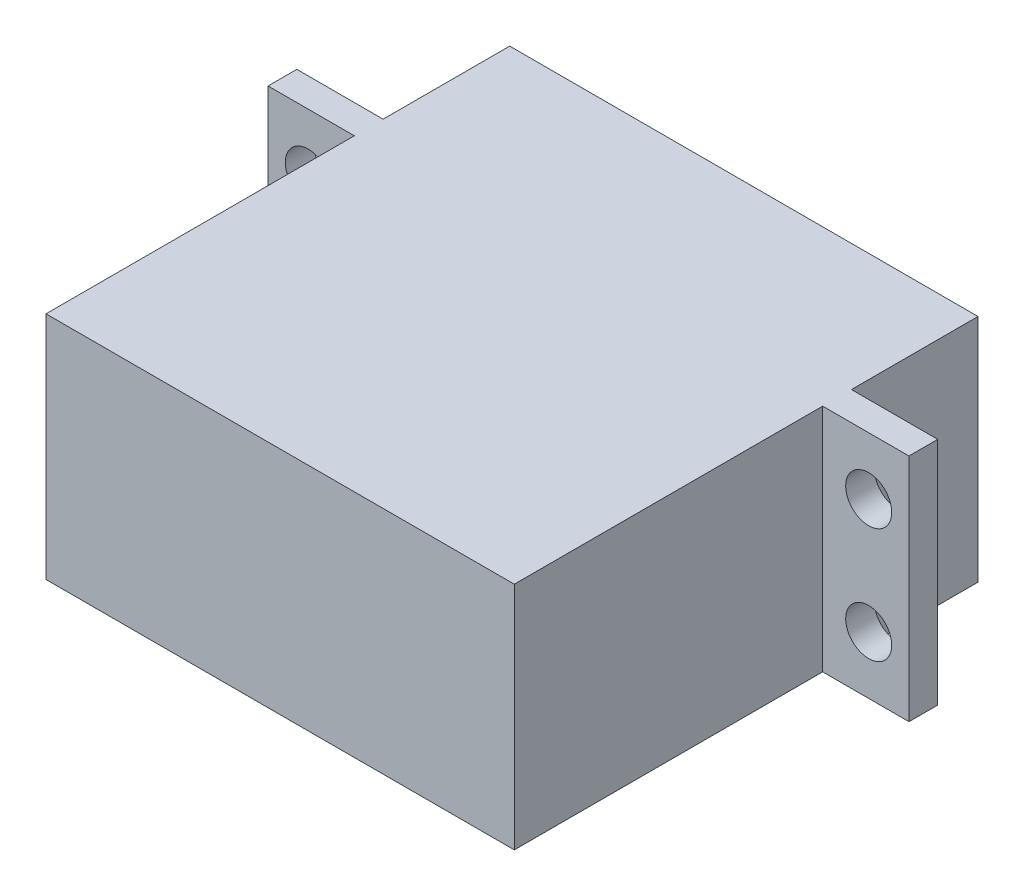
ISO-10303-21;
HEADER;
FILE_DESCRIPTION(('STEP AP214'),'2;1');
FILE_NAME('part.step','',(''),(''),'','','');
FILE_SCHEMA(('AUTOMOTIVE_DESIGN { 1 0 10303 214 1 1 1 1 }'));
ENDSEC;
DATA;
#1=APPLICATION_CONTEXT('core data for automotive mechanical design processes');
#2=APPLICATION_PROTOCOL_DEFINITION('international standard','automotive_design',2000,#1);
#3=PRODUCT_CONTEXT('',#1,'mechanical');
#4=PRODUCT('Part','Part','',(#3));
#5=PRODUCT_RELATED_PRODUCT_CATEGORY('part','',(#4));
#6=PRODUCT_DEFINITION_FORMATION('','',#4);
#7=PRODUCT_DEFINITION_CONTEXT('part definition',#1,'design');
#8=PRODUCT_DEFINITION('design','',#6,#7);
#9=PRODUCT_DEFINITION_SHAPE('','',#8);
#10=(LENGTH_UNIT() NAMED_UNIT(*) SI_UNIT(.MILLI.,.METRE.));
#11=(NAMED_UNIT(*) PLANE_ANGLE_UNIT() SI_UNIT($,.RADIAN.));
#12=(NAMED_UNIT(*) SI_UNIT($,.STERADIAN.) SOLID_ANGLE_UNIT());
#13=UNCERTAINTY_MEASURE_WITH_UNIT(LENGTH_MEASURE(1.E-05),#10,'distance_accuracy_value','');
#14=(GEOMETRIC_REPRESENTATION_CONTEXT(3) GLOBAL_UNCERTAINTY_ASSIGNED_CONTEXT((#13)) GLOBAL_UNIT_ASSIGNED_CONTEXT((#10,
#11,#12)) REPRESENTATION_CONTEXT('',''));
#15=CARTESIAN_POINT('',(0.,0.,0.));
#16=DIRECTION('',(0.,0.,1.));
#17=DIRECTION('',(1.,0.,0.));
#18=AXIS2_PLACEMENT_3D('',#15,#16,#17);
#19=CARTESIAN_POINT('',(0.,0.,0.));
#20=DIRECTION('',(0.,0.,-1.));
#21=DIRECTION('',(-1.,0.,0.));
#22=AXIS2_PLACEMENT_3D('',#19,#20,#21);
#23=PLANE('',#22);
#24=DIRECTION('',(0.,1.,0.));
#25=VECTOR('',#24,1.);
#26=CARTESIAN_POINT('',(20.35,-10.,0.));
#27=LINE('',#26,#25);
#28=CARTESIAN_POINT('',(20.35,-10.,0.));
#29=VERTEX_POINT('',#28);
#30=CARTESIAN_POINT('',(20.35,10.,0.));
#31=VERTEX_POINT('',#30);
#32=EDGE_CURVE('E205',#29,#31,#27,.T.);
#33=ORIENTED_EDGE('',*,*,#32,.F.);
#34=DIRECTION('',(1.,0.,0.));
#35=VECTOR('',#34,1.);
#36=CARTESIAN_POINT('',(-20.35,-10.,0.));
#37=LINE('',#36,#35);
#38=CARTESIAN_POINT('',(-20.35,-10.,0.));
#39=VERTEX_POINT('',#38);
#40=EDGE_CURVE('E242',#39,#29,#37,.T.);
#41=ORIENTED_EDGE('',*,*,#40,.F.);
#42=DIRECTION('',(0.,-1.,0.));
#43=VECTOR('',#42,1.);
#44=CARTESIAN_POINT('',(-20.35,-10.,0.));
#45=LINE('',#44,#43);
#46=CARTESIAN_POINT('',(-20.35,10.,0.));
#47=VERTEX_POINT('',#46);
#48=EDGE_CURVE('E128',#47,#39,#45,.T.);
#49=ORIENTED_EDGE('',*,*,#48,.F.);
#50=DIRECTION('',(-1.,0.,0.));
#51=VECTOR('',#50,1.);
#52=CARTESIAN_POINT('',(-20.35,10.,0.));
#53=LINE('',#52,#51);
#54=EDGE_CURVE('E235',#31,#47,#53,.T.);
#55=ORIENTED_EDGE('',*,*,#54,.F.);
#56=EDGE_LOOP('',(#33,#41,#49,#55));
#57=FACE_BOUND('',#56,.T.);
#58=CARTESIAN_POINT('',(10.35,0.,0.));
#59=DIRECTION('',(0.,0.,-1.));
#60=DIRECTION('',(-1.,0.,0.));
#61=AXIS2_PLACEMENT_3D('',#58,#59,#60);
#62=CIRCLE('',#61,3.);
#63=CARTESIAN_POINT('',(7.34999999999999,0.,0.));
#64=VERTEX_POINT('',#63);
#65=EDGE_CURVE('E482',#64,#64,#62,.T.);
#66=ORIENTED_EDGE('',*,*,#65,.F.);
#67=EDGE_LOOP('',(#66));
#68=FACE_BOUND('',#67,.T.);
#69=ADVANCED_FACE('F34',(#57,#68),#23,.T.);
#70=CARTESIAN_POINT('',(-20.35,-10.,40.3));
#71=DIRECTION('',(1.,0.,0.));
#72=DIRECTION('',(0.,0.,-1.));
#73=AXIS2_PLACEMENT_3D('',#70,#71,#72);
#74=PLANE('',#73);
#75=DIRECTION('',(0.,-1.,0.));
#76=VECTOR('',#75,1.);
#77=CARTESIAN_POINT('',(-20.35,0.,11.));
#78=LINE('',#77,#76);
#79=CARTESIAN_POINT('',(-20.35,10.,11.));
#80=VERTEX_POINT('',#79);
#81=CARTESIAN_POINT('',(-20.35,-10.,11.));
#82=VERTEX_POINT('',#81);
#83=EDGE_CURVE('E51',#80,#82,#78,.T.);
#84=ORIENTED_EDGE('',*,*,#83,.F.);
#85=DIRECTION('',(0.,0.,-1.));
#86=VECTOR('',#85,1.);
#87=CARTESIAN_POINT('',(-20.35,10.,40.3));
#88=LINE('',#87,#86);
#89=EDGE_CURVE('E219',#80,#47,#88,.T.);
#90=ORIENTED_EDGE('',*,*,#89,.T.);
#91=ORIENTED_EDGE('',*,*,#48,.T.);
#92=DIRECTION('',(0.,0.,-1.));
#93=VECTOR('',#92,1.);
#94=CARTESIAN_POINT('',(-20.35,-10.,40.3));
#95=LINE('',#94,#93);
#96=EDGE_CURVE('E124',#82,#39,#95,.T.);
#97=ORIENTED_EDGE('',*,*,#96,.F.);
#98=EDGE_LOOP('',(#84,#90,#91,#97));
#99=FACE_BOUND('',#98,.T.);
#100=ADVANCED_FACE('F126',(#99),#74,.F.);
#101=CARTESIAN_POINT('',(20.35,-10.,40.3));
#102=DIRECTION('',(-1.,0.,0.));
#103=DIRECTION('',(0.,0.,1.));
#104=AXIS2_PLACEMENT_3D('',#101,#102,#103);
#105=PLANE('',#104);
#106=DIRECTION('',(0.,-1.,0.));
#107=VECTOR('',#106,1.);
#108=CARTESIAN_POINT('',(20.35,0.,13.5));
#109=LINE('',#108,#107);
#110=CARTESIAN_POINT('',(20.35,10.,13.5));
#111=VERTEX_POINT('',#110);
#112=CARTESIAN_POINT('',(20.35,-10.,13.5));
#113=VERTEX_POINT('',#112);
#114=EDGE_CURVE('E188',#111,#113,#109,.T.);
#115=ORIENTED_EDGE('',*,*,#114,.F.);
#116=DIRECTION('',(0.,0.,-1.));
#117=VECTOR('',#116,1.);
#118=CARTESIAN_POINT('',(20.35,10.,40.3));
#119=LINE('',#118,#117);
#120=CARTESIAN_POINT('',(20.35,10.,40.3));
#121=VERTEX_POINT('',#120);
#122=EDGE_CURVE('E11',#121,#111,#119,.T.);
#123=ORIENTED_EDGE('',*,*,#122,.F.);
#124=DIRECTION('',(0.,1.,0.));
#125=VECTOR('',#124,1.);
#126=CARTESIAN_POINT('',(20.35,-10.,40.3));
#127=LINE('',#126,#125);
#128=CARTESIAN_POINT('',(20.35,-10.,40.3));
#129=VERTEX_POINT('',#128);
#130=EDGE_CURVE('E244',#129,#121,#127,.T.);
#131=ORIENTED_EDGE('',*,*,#130,.F.);
#132=DIRECTION('',(0.,0.,-1.));
#133=VECTOR('',#132,1.);
#134=CARTESIAN_POINT('',(20.35,-10.,40.3));
#135=LINE('',#134,#133);
#136=EDGE_CURVE('E133',#129,#113,#135,.T.);
#137=ORIENTED_EDGE('',*,*,#136,.T.);
#138=EDGE_LOOP('',(#115,#123,#131,#137));
#139=FACE_BOUND('',#138,.T.);
#140=ADVANCED_FACE('F260',(#139),#105,.F.);
#141=CARTESIAN_POINT('',(20.35,10.,11.));
#142=VERTEX_POINT('',#141);
#143=EDGE_CURVE('E43',#142,#31,#119,.T.);
#144=ORIENTED_EDGE('',*,*,#143,.F.);
#145=DIRECTION('',(0.,-1.,0.));
#146=VECTOR('',#145,1.);
#147=CARTESIAN_POINT('',(20.35,0.,11.));
#148=LINE('',#147,#146);
#149=CARTESIAN_POINT('',(20.35,-10.,11.));
#150=VERTEX_POINT('',#149);
#151=EDGE_CURVE('E175',#142,#150,#148,.T.);
#152=ORIENTED_EDGE('',*,*,#151,.T.);
#153=EDGE_CURVE('E193',#150,#29,#135,.T.);
#154=ORIENTED_EDGE('',*,*,#153,.T.);
#155=ORIENTED_EDGE('',*,*,#32,.T.);
#156=EDGE_LOOP('',(#144,#152,#154,#155));
#157=FACE_BOUND('',#156,.T.);
#158=ADVANCED_FACE('F36',(#157),#105,.F.);
#159=CARTESIAN_POINT('',(-20.35,10.,40.3));
#160=DIRECTION('',(0.,-1.,0.));
#161=DIRECTION('',(0.,0.,-1.));
#162=AXIS2_PLACEMENT_3D('',#159,#160,#161);
#163=PLANE('',#162);
#164=ORIENTED_EDGE('',*,*,#54,.T.);
#165=ORIENTED_EDGE('',*,*,#89,.F.);
#166=DIRECTION('',(-1.,0.,0.));
#167=VECTOR('',#166,1.);
#168=CARTESIAN_POINT('',(-20.35,10.,11.));
#169=LINE('',#168,#167);
#170=CARTESIAN_POINT('',(-27.85,10.,11.));
#171=VERTEX_POINT('',#170);
#172=EDGE_CURVE('E145',#80,#171,#169,.T.);
#173=ORIENTED_EDGE('',*,*,#172,.T.);
#174=DIRECTION('',(0.,0.,1.));
#175=VECTOR('',#174,1.);
#176=CARTESIAN_POINT('',(-27.85,10.,0.));
#177=LINE('',#176,#175);
#178=CARTESIAN_POINT('',(-27.85,10.,13.5));
#179=VERTEX_POINT('',#178);
#180=EDGE_CURVE('E163',#171,#179,#177,.T.);
#181=ORIENTED_EDGE('',*,*,#180,.T.);
#182=DIRECTION('',(-1.,0.,0.));
#183=VECTOR('',#182,1.);
#184=CARTESIAN_POINT('',(-20.35,10.,13.5));
#185=LINE('',#184,#183);
#186=CARTESIAN_POINT('',(-20.35,10.,13.5));
#187=VERTEX_POINT('',#186);
#188=EDGE_CURVE('E192',#187,#179,#185,.T.);
#189=ORIENTED_EDGE('',*,*,#188,.F.);
#190=CARTESIAN_POINT('',(-20.35,10.,40.3));
#191=VERTEX_POINT('',#190);
#192=EDGE_CURVE('E59',#191,#187,#88,.T.);
#193=ORIENTED_EDGE('',*,*,#192,.F.);
#194=DIRECTION('',(-1.,0.,0.));
#195=VECTOR('',#194,1.);
#196=CARTESIAN_POINT('',(-20.35,10.,40.3));
#197=LINE('',#196,#195);
#198=EDGE_CURVE('E251',#121,#191,#197,.T.);
#199=ORIENTED_EDGE('',*,*,#198,.F.);
#200=ORIENTED_EDGE('',*,*,#122,.T.);
#201=DIRECTION('',(-1.,0.,0.));
#202=VECTOR('',#201,1.);
#203=CARTESIAN_POINT('',(27.85,10.,13.5));
#204=LINE('',#203,#202);
#205=CARTESIAN_POINT('',(27.85,10.,13.5));
#206=VERTEX_POINT('',#205);
#207=EDGE_CURVE('E199',#206,#111,#204,.T.);
#208=ORIENTED_EDGE('',*,*,#207,.F.);
#209=DIRECTION('',(0.,0.,1.));
#210=VECTOR('',#209,1.);
#211=CARTESIAN_POINT('',(27.85,10.,0.));
#212=LINE('',#211,#210);
#213=CARTESIAN_POINT('',(27.85,10.,11.));
#214=VERTEX_POINT('',#213);
#215=EDGE_CURVE('E171',#214,#206,#212,.T.);
#216=ORIENTED_EDGE('',*,*,#215,.F.);
#217=DIRECTION('',(-1.,0.,0.));
#218=VECTOR('',#217,1.);
#219=CARTESIAN_POINT('',(27.85,10.,11.));
#220=LINE('',#219,#218);
#221=EDGE_CURVE('E182',#214,#142,#220,.T.);
#222=ORIENTED_EDGE('',*,*,#221,.T.);
#223=ORIENTED_EDGE('',*,*,#143,.T.);
#224=EDGE_LOOP('',(#164,#165,#173,#181,#189,#193,#199,#200,#208,#216,#222,#223));
#225=FACE_BOUND('',#224,.T.);
#226=ADVANCED_FACE('F236',(#225),#163,.F.);
#227=ORIENTED_EDGE('',*,*,#192,.T.);
#228=DIRECTION('',(0.,-1.,0.));
#229=VECTOR('',#228,1.);
#230=CARTESIAN_POINT('',(-20.35,0.,13.5));
#231=LINE('',#230,#229);
#232=CARTESIAN_POINT('',(-20.35,-10.,13.5));
#233=VERTEX_POINT('',#232);
#234=EDGE_CURVE('E149',#187,#233,#231,.T.);
#235=ORIENTED_EDGE('',*,*,#234,.T.);
#236=CARTESIAN_POINT('',(-20.35,-10.,40.3));
#237=VERTEX_POINT('',#236);
#238=EDGE_CURVE('E132',#237,#233,#95,.T.);
#239=ORIENTED_EDGE('',*,*,#238,.F.);
#240=DIRECTION('',(0.,-1.,0.));
#241=VECTOR('',#240,1.);
#242=CARTESIAN_POINT('',(-20.35,-10.,40.3));
#243=LINE('',#242,#241);
#244=EDGE_CURVE('E249',#191,#237,#243,.T.);
#245=ORIENTED_EDGE('',*,*,#244,.F.);
#246=EDGE_LOOP('',(#227,#235,#239,#245));
#247=FACE_BOUND('',#246,.T.);
#248=ADVANCED_FACE('F307',(#247),#74,.F.);
#249=CARTESIAN_POINT('',(-20.35,-10.,40.3));
#250=DIRECTION('',(0.,1.,0.));
#251=DIRECTION('',(0.,0.,1.));
#252=AXIS2_PLACEMENT_3D('',#249,#250,#251);
#253=PLANE('',#252);
#254=ORIENTED_EDGE('',*,*,#40,.T.);
#255=ORIENTED_EDGE('',*,*,#153,.F.);
#256=DIRECTION('',(-1.,0.,0.));
#257=VECTOR('',#256,1.);
#258=CARTESIAN_POINT('',(27.85,-10.,11.));
#259=LINE('',#258,#257);
#260=CARTESIAN_POINT('',(27.85,-10.,11.));
#261=VERTEX_POINT('',#260);
#262=EDGE_CURVE('E200',#261,#150,#259,.T.);
#263=ORIENTED_EDGE('',*,*,#262,.F.);
#264=DIRECTION('',(0.,0.,-1.));
#265=VECTOR('',#264,1.);
#266=CARTESIAN_POINT('',(27.85,-10.,0.));
#267=LINE('',#266,#265);
#268=CARTESIAN_POINT('',(27.85,-10.,13.5));
#269=VERTEX_POINT('',#268);
#270=EDGE_CURVE('E177',#269,#261,#267,.T.);
#271=ORIENTED_EDGE('',*,*,#270,.F.);
#272=DIRECTION('',(-1.,0.,0.));
#273=VECTOR('',#272,1.);
#274=CARTESIAN_POINT('',(27.85,-10.,13.5));
#275=LINE('',#274,#273);
#276=EDGE_CURVE('E196',#269,#113,#275,.T.);
#277=ORIENTED_EDGE('',*,*,#276,.T.);
#278=ORIENTED_EDGE('',*,*,#136,.F.);
#279=DIRECTION('',(1.,0.,0.));
#280=VECTOR('',#279,1.);
#281=CARTESIAN_POINT('',(-20.35,-10.,40.3));
#282=LINE('',#281,#280);
#283=EDGE_CURVE('E247',#237,#129,#282,.T.);
#284=ORIENTED_EDGE('',*,*,#283,.F.);
#285=ORIENTED_EDGE('',*,*,#238,.T.);
#286=DIRECTION('',(-1.,0.,0.));
#287=VECTOR('',#286,1.);
#288=CARTESIAN_POINT('',(-20.35,-10.,13.5));
#289=LINE('',#288,#287);
#290=CARTESIAN_POINT('',(-27.85,-10.,13.5));
#291=VERTEX_POINT('',#290);
#292=EDGE_CURVE('E144',#233,#291,#289,.T.);
#293=ORIENTED_EDGE('',*,*,#292,.T.);
#294=DIRECTION('',(0.,0.,-1.));
#295=VECTOR('',#294,1.);
#296=CARTESIAN_POINT('',(-27.85,-10.,0.));
#297=LINE('',#296,#295);
#298=CARTESIAN_POINT('',(-27.85,-10.,11.));
#299=VERTEX_POINT('',#298);
#300=EDGE_CURVE('E140',#291,#299,#297,.T.);
#301=ORIENTED_EDGE('',*,*,#300,.T.);
#302=DIRECTION('',(-1.,0.,0.));
#303=VECTOR('',#302,1.);
#304=CARTESIAN_POINT('',(-20.35,-10.,11.));
#305=LINE('',#304,#303);
#306=EDGE_CURVE('E136',#82,#299,#305,.T.);
#307=ORIENTED_EDGE('',*,*,#306,.F.);
#308=ORIENTED_EDGE('',*,*,#96,.T.);
#309=EDGE_LOOP('',(#254,#255,#263,#271,#277,#278,#284,#285,#293,#301,#307,#308));
#310=FACE_BOUND('',#309,.T.);
#311=ADVANCED_FACE('F137',(#310),#253,.F.);
#312=CARTESIAN_POINT('',(0.,0.,40.3));
#313=DIRECTION('',(0.,0.,-1.));
#314=DIRECTION('',(-1.,0.,0.));
#315=AXIS2_PLACEMENT_3D('',#312,#313,#314);
#316=PLANE('',#315);
#317=ORIENTED_EDGE('',*,*,#130,.T.);
#318=ORIENTED_EDGE('',*,*,#198,.T.);
#319=ORIENTED_EDGE('',*,*,#244,.T.);
#320=ORIENTED_EDGE('',*,*,#283,.T.);
#321=EDGE_LOOP('',(#317,#318,#319,#320));
#322=FACE_BOUND('',#321,.T.);
#323=ADVANCED_FACE('F256',(#322),#316,.F.);
#324=CARTESIAN_POINT('',(27.85,0.,13.5));
#325=DIRECTION('',(0.,0.,-1.));
#326=DIRECTION('',(0.,1.,0.));
#327=AXIS2_PLACEMENT_3D('',#324,#325,#326);
#328=PLANE('',#327);
#329=CARTESIAN_POINT('',(24.35,-5.,13.5));
#330=DIRECTION('',(0.,0.,-1.));
#331=DIRECTION('',(0.,1.,0.));
#332=AXIS2_PLACEMENT_3D('',#329,#330,#331);
#333=CIRCLE('',#332,2.);
#334=CARTESIAN_POINT('',(24.35,-3.,13.5));
#335=VERTEX_POINT('',#334);
#336=EDGE_CURVE('E473',#335,#335,#333,.T.);
#337=ORIENTED_EDGE('',*,*,#336,.T.);
#338=EDGE_LOOP('',(#337));
#339=FACE_BOUND('',#338,.T.);
#340=CARTESIAN_POINT('',(24.35,5.,13.5));
#341=DIRECTION('',(0.,0.,-1.));
#342=DIRECTION('',(0.,1.,0.));
#343=AXIS2_PLACEMENT_3D('',#340,#341,#342);
#344=CIRCLE('',#343,2.);
#345=CARTESIAN_POINT('',(24.35,7.,13.5));
#346=VERTEX_POINT('',#345);
#347=EDGE_CURVE('E479',#346,#346,#344,.T.);
#348=ORIENTED_EDGE('',*,*,#347,.T.);
#349=EDGE_LOOP('',(#348));
#350=FACE_BOUND('',#349,.T.);
#351=ORIENTED_EDGE('',*,*,#114,.T.);
#352=ORIENTED_EDGE('',*,*,#276,.F.);
#353=DIRECTION('',(0.,-1.,0.));
#354=VECTOR('',#353,1.);
#355=CARTESIAN_POINT('',(27.85,0.,13.5));
#356=LINE('',#355,#354);
#357=EDGE_CURVE('E174',#206,#269,#356,.T.);
#358=ORIENTED_EDGE('',*,*,#357,.F.);
#359=ORIENTED_EDGE('',*,*,#207,.T.);
#360=EDGE_LOOP('',(#351,#352,#358,#359));
#361=FACE_BOUND('',#360,.T.);
#362=ADVANCED_FACE('F264',(#339,#350,#361),#328,.F.);
#363=CARTESIAN_POINT('',(27.85,0.,11.));
#364=DIRECTION('',(0.,0.,-1.));
#365=DIRECTION('',(0.,1.,0.));
#366=AXIS2_PLACEMENT_3D('',#363,#364,#365);
#367=PLANE('',#366);
#368=CARTESIAN_POINT('',(24.35,-5.,11.));
#369=DIRECTION('',(0.,0.,-1.));
#370=DIRECTION('',(0.,1.,0.));
#371=AXIS2_PLACEMENT_3D('',#368,#369,#370);
#372=CIRCLE('',#371,2.);
#373=CARTESIAN_POINT('',(24.35,-3.,11.));
#374=VERTEX_POINT('',#373);
#375=EDGE_CURVE('E470',#374,#374,#372,.T.);
#376=ORIENTED_EDGE('',*,*,#375,.F.);
#377=EDGE_LOOP('',(#376));
#378=FACE_BOUND('',#377,.T.);
#379=CARTESIAN_POINT('',(24.35,5.,11.));
#380=DIRECTION('',(0.,0.,-1.));
#381=DIRECTION('',(0.,1.,0.));
#382=AXIS2_PLACEMENT_3D('',#379,#380,#381);
#383=CIRCLE('',#382,2.);
#384=CARTESIAN_POINT('',(24.35,7.,11.));
#385=VERTEX_POINT('',#384);
#386=EDGE_CURVE('E476',#385,#385,#383,.T.);
#387=ORIENTED_EDGE('',*,*,#386,.F.);
#388=EDGE_LOOP('',(#387));
#389=FACE_BOUND('',#388,.T.);
#390=ORIENTED_EDGE('',*,*,#151,.F.);
#391=ORIENTED_EDGE('',*,*,#221,.F.);
#392=DIRECTION('',(0.,-1.,0.));
#393=VECTOR('',#392,1.);
#394=CARTESIAN_POINT('',(27.85,0.,11.));
#395=LINE('',#394,#393);
#396=EDGE_CURVE('E179',#214,#261,#395,.T.);
#397=ORIENTED_EDGE('',*,*,#396,.T.);
#398=ORIENTED_EDGE('',*,*,#262,.T.);
#399=EDGE_LOOP('',(#390,#391,#397,#398));
#400=FACE_BOUND('',#399,.T.);
#401=ADVANCED_FACE('F272',(#378,#389,#400),#367,.T.);
#402=CARTESIAN_POINT('',(27.85,0.,0.));
#403=DIRECTION('',(1.,0.,0.));
#404=DIRECTION('',(0.,0.,-1.));
#405=AXIS2_PLACEMENT_3D('',#402,#403,#404);
#406=PLANE('',#405);
#407=ORIENTED_EDGE('',*,*,#215,.T.);
#408=ORIENTED_EDGE('',*,*,#357,.T.);
#409=ORIENTED_EDGE('',*,*,#270,.T.);
#410=ORIENTED_EDGE('',*,*,#396,.F.);
#411=EDGE_LOOP('',(#407,#408,#409,#410));
#412=FACE_BOUND('',#411,.T.);
#413=ADVANCED_FACE('F269',(#412),#406,.T.);
#414=CARTESIAN_POINT('',(-20.35,0.,13.5));
#415=DIRECTION('',(0.,0.,-1.));
#416=DIRECTION('',(0.,1.,0.));
#417=AXIS2_PLACEMENT_3D('',#414,#415,#416);
#418=PLANE('',#417);
#419=CARTESIAN_POINT('',(-24.35,-5.,13.5));
#420=DIRECTION('',(0.,0.,-1.));
#421=DIRECTION('',(0.,1.,0.));
#422=AXIS2_PLACEMENT_3D('',#419,#420,#421);
#423=CIRCLE('',#422,2.);
#424=CARTESIAN_POINT('',(-24.35,-3.,13.5));
#425=VERTEX_POINT('',#424);
#426=EDGE_CURVE('E460',#425,#425,#423,.T.);
#427=ORIENTED_EDGE('',*,*,#426,.T.);
#428=EDGE_LOOP('',(#427));
#429=FACE_BOUND('',#428,.T.);
#430=CARTESIAN_POINT('',(-24.35,5.,13.5));
#431=DIRECTION('',(0.,0.,-1.));
#432=DIRECTION('',(0.,1.,0.));
#433=AXIS2_PLACEMENT_3D('',#430,#431,#432);
#434=CIRCLE('',#433,2.);
#435=CARTESIAN_POINT('',(-24.35,7.,13.5));
#436=VERTEX_POINT('',#435);
#437=EDGE_CURVE('E464',#436,#436,#434,.T.);
#438=ORIENTED_EDGE('',*,*,#437,.T.);
#439=EDGE_LOOP('',(#438));
#440=FACE_BOUND('',#439,.T.);
#441=DIRECTION('',(0.,-1.,0.));
#442=VECTOR('',#441,1.);
#443=CARTESIAN_POINT('',(-27.85,0.,13.5));
#444=LINE('',#443,#442);
#445=EDGE_CURVE('E166',#179,#291,#444,.T.);
#446=ORIENTED_EDGE('',*,*,#445,.T.);
#447=ORIENTED_EDGE('',*,*,#292,.F.);
#448=ORIENTED_EDGE('',*,*,#234,.F.);
#449=ORIENTED_EDGE('',*,*,#188,.T.);
#450=EDGE_LOOP('',(#446,#447,#448,#449));
#451=FACE_BOUND('',#450,.T.);
#452=ADVANCED_FACE('F279',(#429,#440,#451),#418,.F.);
#453=CARTESIAN_POINT('',(-20.35,0.,11.));
#454=DIRECTION('',(0.,0.,-1.));
#455=DIRECTION('',(0.,1.,0.));
#456=AXIS2_PLACEMENT_3D('',#453,#454,#455);
#457=PLANE('',#456);
#458=CARTESIAN_POINT('',(-24.35,-5.,11.));
#459=DIRECTION('',(0.,0.,-1.));
#460=DIRECTION('',(0.,1.,0.));
#461=AXIS2_PLACEMENT_3D('',#458,#459,#460);
#462=CIRCLE('',#461,2.);
#463=CARTESIAN_POINT('',(-24.35,-3.,11.));
#464=VERTEX_POINT('',#463);
#465=EDGE_CURVE('E457',#464,#464,#462,.T.);
#466=ORIENTED_EDGE('',*,*,#465,.F.);
#467=EDGE_LOOP('',(#466));
#468=FACE_BOUND('',#467,.T.);
#469=CARTESIAN_POINT('',(-24.35,5.,11.));
#470=DIRECTION('',(0.,0.,-1.));
#471=DIRECTION('',(0.,1.,0.));
#472=AXIS2_PLACEMENT_3D('',#469,#470,#471);
#473=CIRCLE('',#472,2.);
#474=CARTESIAN_POINT('',(-24.35,7.,11.));
#475=VERTEX_POINT('',#474);
#476=EDGE_CURVE('E461',#475,#475,#473,.T.);
#477=ORIENTED_EDGE('',*,*,#476,.F.);
#478=EDGE_LOOP('',(#477));
#479=FACE_BOUND('',#478,.T.);
#480=DIRECTION('',(0.,-1.,0.));
#481=VECTOR('',#480,1.);
#482=CARTESIAN_POINT('',(-27.85,0.,11.));
#483=LINE('',#482,#481);
#484=EDGE_CURVE('E152',#171,#299,#483,.T.);
#485=ORIENTED_EDGE('',*,*,#484,.F.);
#486=ORIENTED_EDGE('',*,*,#172,.F.);
#487=ORIENTED_EDGE('',*,*,#83,.T.);
#488=ORIENTED_EDGE('',*,*,#306,.T.);
#489=EDGE_LOOP('',(#485,#486,#487,#488));
#490=FACE_BOUND('',#489,.T.);
#491=ADVANCED_FACE('F148',(#468,#479,#490),#457,.T.);
#492=CARTESIAN_POINT('',(-27.85,0.,0.));
#493=DIRECTION('',(1.,0.,0.));
#494=DIRECTION('',(0.,0.,-1.));
#495=AXIS2_PLACEMENT_3D('',#492,#493,#494);
#496=PLANE('',#495);
#497=ORIENTED_EDGE('',*,*,#180,.F.);
#498=ORIENTED_EDGE('',*,*,#484,.T.);
#499=ORIENTED_EDGE('',*,*,#300,.F.);
#500=ORIENTED_EDGE('',*,*,#445,.F.);
#501=EDGE_LOOP('',(#497,#498,#499,#500));
#502=FACE_BOUND('',#501,.T.);
#503=ADVANCED_FACE('F288',(#502),#496,.F.);
#504=CARTESIAN_POINT('',(10.35,0.,-4.));
#505=DIRECTION('',(0.,0.,1.));
#506=DIRECTION('',(1.,0.,0.));
#507=AXIS2_PLACEMENT_3D('',#504,#505,#506);
#508=CYLINDRICAL_SURFACE('',#507,3.);
#509=CARTESIAN_POINT('',(10.35,0.,-4.));
#510=DIRECTION('',(0.,0.,-1.));
#511=DIRECTION('',(-1.,0.,0.));
#512=AXIS2_PLACEMENT_3D('',#509,#510,#511);
#513=CIRCLE('',#512,3.);
#514=CARTESIAN_POINT('',(7.34999999999999,0.,-4.));
#515=VERTEX_POINT('',#514);
#516=EDGE_CURVE('E167',#515,#515,#513,.T.);
#517=ORIENTED_EDGE('',*,*,#516,.F.);
#518=EDGE_LOOP('',(#517));
#519=FACE_BOUND('',#518,.T.);
#520=ORIENTED_EDGE('',*,*,#65,.T.);
#521=EDGE_LOOP('',(#520));
#522=FACE_BOUND('',#521,.T.);
#523=ADVANCED_FACE('F290',(#519,#522),#508,.T.);
#524=CARTESIAN_POINT('',(10.35,0.,-4.));
#525=DIRECTION('',(0.,0.,-1.));
#526=DIRECTION('',(-1.,0.,0.));
#527=AXIS2_PLACEMENT_3D('',#524,#525,#526);
#528=PLANE('',#527);
#529=ORIENTED_EDGE('',*,*,#516,.T.);
#530=EDGE_LOOP('',(#529));
#531=FACE_BOUND('',#530,.T.);
#532=ADVANCED_FACE('F296',(#531),#528,.T.);
#533=CARTESIAN_POINT('',(24.35,5.,21.));
#534=DIRECTION('',(0.,0.,-1.));
#535=DIRECTION('',(0.,1.,0.));
#536=AXIS2_PLACEMENT_3D('',#533,#534,#535);
#537=CYLINDRICAL_SURFACE('',#536,2.);
#538=ORIENTED_EDGE('',*,*,#386,.T.);
#539=EDGE_LOOP('',(#538));
#540=FACE_BOUND('',#539,.T.);
#541=ORIENTED_EDGE('',*,*,#347,.F.);
#542=EDGE_LOOP('',(#541));
#543=FACE_BOUND('',#542,.T.);
#544=ADVANCED_FACE('F377',(#540,#543),#537,.F.);
#545=CARTESIAN_POINT('',(24.35,-5.,21.));
#546=DIRECTION('',(0.,0.,-1.));
#547=DIRECTION('',(0.,1.,0.));
#548=AXIS2_PLACEMENT_3D('',#545,#546,#547);
#549=CYLINDRICAL_SURFACE('',#548,2.);
#550=ORIENTED_EDGE('',*,*,#375,.T.);
#551=EDGE_LOOP('',(#550));
#552=FACE_BOUND('',#551,.T.);
#553=ORIENTED_EDGE('',*,*,#336,.F.);
#554=EDGE_LOOP('',(#553));
#555=FACE_BOUND('',#554,.T.);
#556=ADVANCED_FACE('F420',(#552,#555),#549,.F.);
#557=CARTESIAN_POINT('',(-24.35,5.,21.));
#558=DIRECTION('',(0.,0.,-1.));
#559=DIRECTION('',(0.,1.,0.));
#560=AXIS2_PLACEMENT_3D('',#557,#558,#559);
#561=CYLINDRICAL_SURFACE('',#560,2.);
#562=ORIENTED_EDGE('',*,*,#476,.T.);
#563=EDGE_LOOP('',(#562));
#564=FACE_BOUND('',#563,.T.);
#565=ORIENTED_EDGE('',*,*,#437,.F.);
#566=EDGE_LOOP('',(#565));
#567=FACE_BOUND('',#566,.T.);
#568=ADVANCED_FACE('F430',(#564,#567),#561,.F.);
#569=CARTESIAN_POINT('',(-24.35,-5.,21.));
#570=DIRECTION('',(0.,0.,-1.));
#571=DIRECTION('',(0.,1.,0.));
#572=AXIS2_PLACEMENT_3D('',#569,#570,#571);
#573=CYLINDRICAL_SURFACE('',#572,2.);
#574=ORIENTED_EDGE('',*,*,#465,.T.);
#575=EDGE_LOOP('',(#574));
#576=FACE_BOUND('',#575,.T.);
#577=ORIENTED_EDGE('',*,*,#426,.F.);
#578=EDGE_LOOP('',(#577));
#579=FACE_BOUND('',#578,.T.);
#580=ADVANCED_FACE('F440',(#576,#579),#573,.F.);
#581=CLOSED_SHELL('',(#69,#100,#140,#158,#226,#248,#311,#323,#362,#401,#413,#452,#491,#503,#523,
#532,#544,#556,#568,#580));
#582=MANIFOLD_SOLID_BREP('B2',#581);
#583=ADVANCED_BREP_SHAPE_REPRESENTATION('',(#18,#582),#14);
#584=SHAPE_DEFINITION_REPRESENTATION(#9,#583);
ENDSEC;
END-ISO-10303-21;
